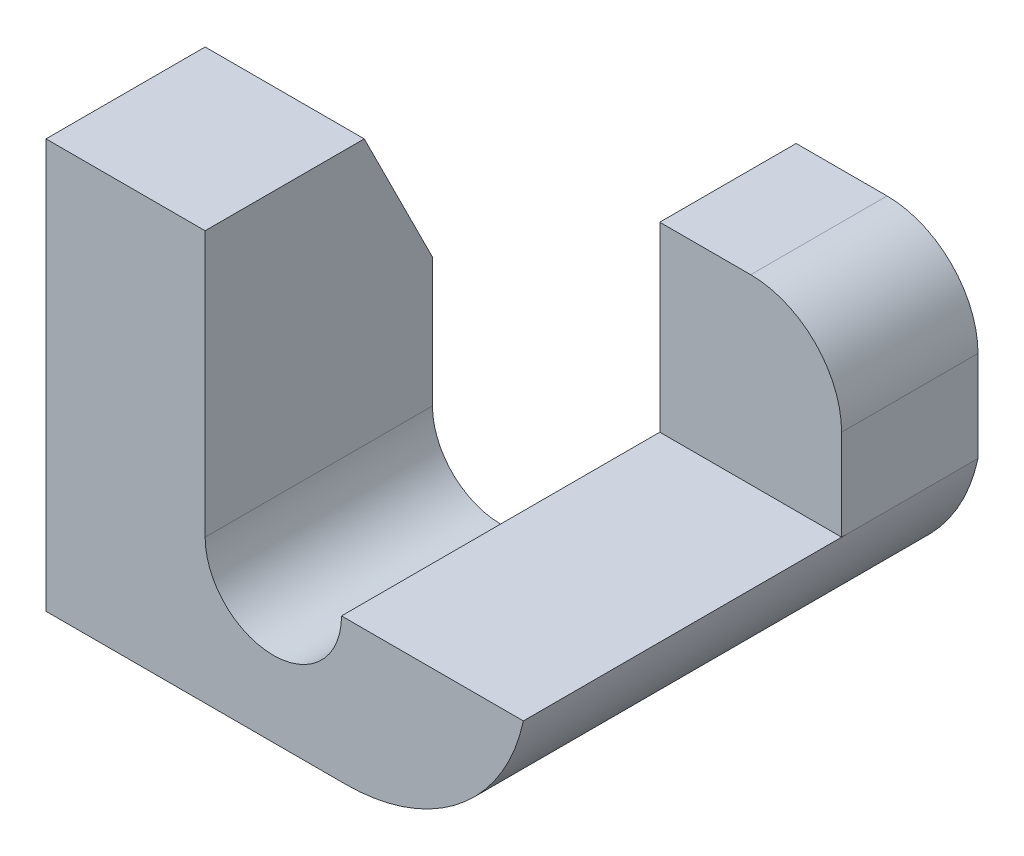
ISO-10303-21;
HEADER;
FILE_DESCRIPTION(('STEP AP214'),'2;1');
FILE_NAME('part.step','',(''),(''),'','','');
FILE_SCHEMA(('AUTOMOTIVE_DESIGN { 1 0 10303 214 1 1 1 1 }'));
ENDSEC;
DATA;
#1=APPLICATION_CONTEXT('core data for automotive mechanical design processes');
#2=APPLICATION_PROTOCOL_DEFINITION('international standard','automotive_design',2000,#1);
#3=PRODUCT_CONTEXT('',#1,'mechanical');
#4=PRODUCT('Part','Part','',(#3));
#5=PRODUCT_RELATED_PRODUCT_CATEGORY('part','',(#4));
#6=PRODUCT_DEFINITION_FORMATION('','',#4);
#7=PRODUCT_DEFINITION_CONTEXT('part definition',#1,'design');
#8=PRODUCT_DEFINITION('design','',#6,#7);
#9=PRODUCT_DEFINITION_SHAPE('','',#8);
#10=(LENGTH_UNIT() NAMED_UNIT(*) SI_UNIT(.MILLI.,.METRE.));
#11=(NAMED_UNIT(*) PLANE_ANGLE_UNIT() SI_UNIT($,.RADIAN.));
#12=(NAMED_UNIT(*) SI_UNIT($,.STERADIAN.) SOLID_ANGLE_UNIT());
#13=UNCERTAINTY_MEASURE_WITH_UNIT(LENGTH_MEASURE(1.E-05),#10,'distance_accuracy_value','');
#14=(GEOMETRIC_REPRESENTATION_CONTEXT(3) GLOBAL_UNCERTAINTY_ASSIGNED_CONTEXT((#13)) GLOBAL_UNIT_ASSIGNED_CONTEXT((#10,
#11,#12)) REPRESENTATION_CONTEXT('',''));
#15=CARTESIAN_POINT('',(0.,0.,0.));
#16=DIRECTION('',(0.,0.,1.));
#17=DIRECTION('',(1.,0.,0.));
#18=AXIS2_PLACEMENT_3D('',#15,#16,#17);
#19=CARTESIAN_POINT('',(52.,25.3004397130294,-40.));
#20=DIRECTION('',(0.,1.,0.));
#21=DIRECTION('',(0.,0.,1.));
#22=AXIS2_PLACEMENT_3D('',#19,#20,#21);
#23=PLANE('',#22);
#24=DIRECTION('',(0.,0.,1.));
#25=VECTOR('',#24,1.);
#26=CARTESIAN_POINT('',(84.,25.3004397130294,-40.));
#27=LINE('',#26,#25);
#28=CARTESIAN_POINT('',(84.,25.3004397130294,-56.));
#29=VERTEX_POINT('',#28);
#30=CARTESIAN_POINT('',(84.,25.3004397130294,0.));
#31=VERTEX_POINT('',#30);
#32=EDGE_CURVE('E221',#29,#31,#27,.T.);
#33=ORIENTED_EDGE('',*,*,#32,.F.);
#34=DIRECTION('',(1.,0.,0.));
#35=VECTOR('',#34,1.);
#36=CARTESIAN_POINT('',(52.,25.3004397130294,-56.));
#37=LINE('',#36,#35);
#38=CARTESIAN_POINT('',(52.,25.3004397130294,-56.));
#39=VERTEX_POINT('',#38);
#40=EDGE_CURVE('E302',#39,#29,#37,.T.);
#41=ORIENTED_EDGE('',*,*,#40,.F.);
#42=DIRECTION('',(0.,0.,1.));
#43=VECTOR('',#42,1.);
#44=CARTESIAN_POINT('',(52.,25.3004397130293,-80.));
#45=LINE('',#44,#43);
#46=CARTESIAN_POINT('',(52.,25.3004397130293,-40.));
#47=VERTEX_POINT('',#46);
#48=EDGE_CURVE('E274',#39,#47,#45,.T.);
#49=ORIENTED_EDGE('',*,*,#48,.T.);
#50=DIRECTION('',(0.,0.,1.));
#51=VECTOR('',#50,1.);
#52=CARTESIAN_POINT('',(52.,25.3004397130294,-40.));
#53=LINE('',#52,#51);
#54=CARTESIAN_POINT('',(52.,25.3004397130294,0.));
#55=VERTEX_POINT('',#54);
#56=EDGE_CURVE('E214',#47,#55,#53,.T.);
#57=ORIENTED_EDGE('',*,*,#56,.T.);
#58=DIRECTION('',(-1.,0.,0.));
#59=VECTOR('',#58,1.);
#60=CARTESIAN_POINT('',(52.,25.3004397130294,0.));
#61=LINE('',#60,#59);
#62=EDGE_CURVE('E182',#31,#55,#61,.T.);
#63=ORIENTED_EDGE('',*,*,#62,.F.);
#64=EDGE_LOOP('',(#33,#41,#49,#57,#63));
#65=FACE_BOUND('',#64,.T.);
#66=ADVANCED_FACE('F45',(#65),#23,.T.);
#67=CARTESIAN_POINT('',(40.,25.3004397130294,-40.));
#68=DIRECTION('',(0.,0.,1.));
#69=DIRECTION('',(1.,0.,0.));
#70=AXIS2_PLACEMENT_3D('',#67,#68,#69);
#71=PLANE('',#70);
#72=DIRECTION('',(0.,-1.,0.));
#73=VECTOR('',#72,1.);
#74=CARTESIAN_POINT('',(0.,0.,-40.));
#75=LINE('',#74,#73);
#76=CARTESIAN_POINT('',(0.,48.,-40.));
#77=VERTEX_POINT('',#76);
#78=CARTESIAN_POINT('',(0.,0.,-40.));
#79=VERTEX_POINT('',#78);
#80=EDGE_CURVE('E155',#77,#79,#75,.T.);
#81=ORIENTED_EDGE('',*,*,#80,.F.);
#82=DIRECTION('',(1.,0.,0.));
#83=VECTOR('',#82,1.);
#84=CARTESIAN_POINT('',(-4.,48.,-40.));
#85=LINE('',#84,#83);
#86=CARTESIAN_POINT('',(28.,48.,-40.));
#87=VERTEX_POINT('',#86);
#88=EDGE_CURVE('E140',#77,#87,#85,.T.);
#89=ORIENTED_EDGE('',*,*,#88,.T.);
#90=DIRECTION('',(0.,1.,0.));
#91=VECTOR('',#90,1.);
#92=CARTESIAN_POINT('',(28.,72.,-40.));
#93=LINE('',#92,#91);
#94=CARTESIAN_POINT('',(28.,25.3004397130294,-40.));
#95=VERTEX_POINT('',#94);
#96=EDGE_CURVE('E152',#95,#87,#93,.T.);
#97=ORIENTED_EDGE('',*,*,#96,.F.);
#98=CARTESIAN_POINT('',(40.,25.3004397130294,-40.));
#99=DIRECTION('',(0.,0.,-1.));
#100=DIRECTION('',(1.,0.,0.));
#101=AXIS2_PLACEMENT_3D('',#98,#99,#100);
#102=CIRCLE('',#101,12.);
#103=EDGE_CURVE('E163',#47,#95,#102,.T.);
#104=ORIENTED_EDGE('',*,*,#103,.F.);
#105=DIRECTION('',(0.,1.,0.));
#106=VECTOR('',#105,1.);
#107=CARTESIAN_POINT('',(52.,25.3004397130293,-40.));
#108=LINE('',#107,#106);
#109=CARTESIAN_POINT('',(52.,0.,-40.));
#110=VERTEX_POINT('',#109);
#111=EDGE_CURVE('E261',#110,#47,#108,.T.);
#112=ORIENTED_EDGE('',*,*,#111,.F.);
#113=DIRECTION('',(1.,0.,0.));
#114=VECTOR('',#113,1.);
#115=CARTESIAN_POINT('',(52.7091723989082,0.,-40.));
#116=LINE('',#115,#114);
#117=EDGE_CURVE('E169',#79,#110,#116,.T.);
#118=ORIENTED_EDGE('',*,*,#117,.F.);
#119=EDGE_LOOP('',(#81,#89,#97,#104,#112,#118));
#120=FACE_BOUND('',#119,.T.);
#121=ADVANCED_FACE('F150',(#120),#71,.F.);
#122=CARTESIAN_POINT('',(52.7091723989082,0.,-40.));
#123=DIRECTION('',(0.,-1.,0.));
#124=DIRECTION('',(0.,0.,-1.));
#125=AXIS2_PLACEMENT_3D('',#122,#123,#124);
#126=PLANE('',#125);
#127=DIRECTION('',(1.,0.,0.));
#128=VECTOR('',#127,1.);
#129=CARTESIAN_POINT('',(52.7091723989082,0.,0.));
#130=LINE('',#129,#128);
#131=CARTESIAN_POINT('',(0.,0.,0.));
#132=VERTEX_POINT('',#131);
#133=CARTESIAN_POINT('',(52.7091723989082,0.,0.));
#134=VERTEX_POINT('',#133);
#135=EDGE_CURVE('E173',#132,#134,#130,.T.);
#136=ORIENTED_EDGE('',*,*,#135,.F.);
#137=DIRECTION('',(0.,0.,1.));
#138=VECTOR('',#137,1.);
#139=CARTESIAN_POINT('',(0.,0.,-40.));
#140=LINE('',#139,#138);
#141=EDGE_CURVE('E202',#79,#132,#140,.T.);
#142=ORIENTED_EDGE('',*,*,#141,.F.);
#143=ORIENTED_EDGE('',*,*,#117,.T.);
#144=DIRECTION('',(0.,0.,1.));
#145=VECTOR('',#144,1.);
#146=CARTESIAN_POINT('',(52.,0.,-80.));
#147=LINE('',#146,#145);
#148=CARTESIAN_POINT('',(52.,0.,-80.));
#149=VERTEX_POINT('',#148);
#150=EDGE_CURVE('E178',#149,#110,#147,.T.);
#151=ORIENTED_EDGE('',*,*,#150,.F.);
#152=DIRECTION('',(-1.,0.,0.));
#153=VECTOR('',#152,1.);
#154=CARTESIAN_POINT('',(52.7091723989082,0.,-80.));
#155=LINE('',#154,#153);
#156=CARTESIAN_POINT('',(52.7091723989082,0.,-80.));
#157=VERTEX_POINT('',#156);
#158=EDGE_CURVE('E252',#157,#149,#155,.T.);
#159=ORIENTED_EDGE('',*,*,#158,.F.);
#160=DIRECTION('',(0.,0.,1.));
#161=VECTOR('',#160,1.);
#162=CARTESIAN_POINT('',(52.7091723989082,0.,-40.));
#163=LINE('',#162,#161);
#164=EDGE_CURVE('E167',#157,#134,#163,.T.);
#165=ORIENTED_EDGE('',*,*,#164,.T.);
#166=EDGE_LOOP('',(#136,#142,#143,#151,#159,#165));
#167=FACE_BOUND('',#166,.T.);
#168=ADVANCED_FACE('F248',(#167),#126,.T.);
#169=CARTESIAN_POINT('',(0.,0.,-40.));
#170=DIRECTION('',(-1.,0.,0.));
#171=DIRECTION('',(0.,0.,1.));
#172=AXIS2_PLACEMENT_3D('',#169,#170,#171);
#173=PLANE('',#172);
#174=DIRECTION('',(0.,0.894427190999916,0.447213595499958));
#175=VECTOR('',#174,1.);
#176=CARTESIAN_POINT('',(0.,9.6,-59.2));
#177=LINE('',#176,#175);
#178=CARTESIAN_POINT('',(0.,72.,-28.));
#179=VERTEX_POINT('',#178);
#180=EDGE_CURVE('E157',#77,#179,#177,.T.);
#181=ORIENTED_EDGE('',*,*,#180,.F.);
#182=ORIENTED_EDGE('',*,*,#80,.T.);
#183=ORIENTED_EDGE('',*,*,#141,.T.);
#184=DIRECTION('',(0.,-1.,0.));
#185=VECTOR('',#184,1.);
#186=CARTESIAN_POINT('',(0.,0.,0.));
#187=LINE('',#186,#185);
#188=CARTESIAN_POINT('',(0.,72.,0.));
#189=VERTEX_POINT('',#188);
#190=EDGE_CURVE('E198',#189,#132,#187,.T.);
#191=ORIENTED_EDGE('',*,*,#190,.F.);
#192=DIRECTION('',(0.,0.,1.));
#193=VECTOR('',#192,1.);
#194=CARTESIAN_POINT('',(0.,72.,-40.));
#195=LINE('',#194,#193);
#196=EDGE_CURVE('E206',#179,#189,#195,.T.);
#197=ORIENTED_EDGE('',*,*,#196,.F.);
#198=EDGE_LOOP('',(#181,#182,#183,#191,#197));
#199=FACE_BOUND('',#198,.T.);
#200=ADVANCED_FACE('F316',(#199),#173,.T.);
#201=CARTESIAN_POINT('',(0.,72.,-40.));
#202=DIRECTION('',(0.,1.,0.));
#203=DIRECTION('',(0.,0.,1.));
#204=AXIS2_PLACEMENT_3D('',#201,#202,#203);
#205=PLANE('',#204);
#206=DIRECTION('',(1.,0.,0.));
#207=VECTOR('',#206,1.);
#208=CARTESIAN_POINT('',(-4.,72.,-28.));
#209=LINE('',#208,#207);
#210=CARTESIAN_POINT('',(28.,72.,-28.));
#211=VERTEX_POINT('',#210);
#212=EDGE_CURVE('E61',#179,#211,#209,.T.);
#213=ORIENTED_EDGE('',*,*,#212,.F.);
#214=ORIENTED_EDGE('',*,*,#196,.T.);
#215=DIRECTION('',(-1.,0.,0.));
#216=VECTOR('',#215,1.);
#217=CARTESIAN_POINT('',(0.,72.,0.));
#218=LINE('',#217,#216);
#219=CARTESIAN_POINT('',(28.,72.,0.));
#220=VERTEX_POINT('',#219);
#221=EDGE_CURVE('E194',#220,#189,#218,.T.);
#222=ORIENTED_EDGE('',*,*,#221,.F.);
#223=DIRECTION('',(0.,0.,1.));
#224=VECTOR('',#223,1.);
#225=CARTESIAN_POINT('',(28.,72.,-40.));
#226=LINE('',#225,#224);
#227=EDGE_CURVE('E209',#211,#220,#226,.T.);
#228=ORIENTED_EDGE('',*,*,#227,.F.);
#229=EDGE_LOOP('',(#213,#214,#222,#228));
#230=FACE_BOUND('',#229,.T.);
#231=ADVANCED_FACE('F313',(#230),#205,.T.);
#232=CARTESIAN_POINT('',(28.,72.,-40.));
#233=DIRECTION('',(1.,0.,0.));
#234=DIRECTION('',(0.,1.,0.));
#235=AXIS2_PLACEMENT_3D('',#232,#233,#234);
#236=PLANE('',#235);
#237=DIRECTION('',(0.,-0.894427190999916,-0.447213595499958));
#238=VECTOR('',#237,1.);
#239=CARTESIAN_POINT('',(28.,72.,-28.));
#240=LINE('',#239,#238);
#241=EDGE_CURVE('E137',#211,#87,#240,.T.);
#242=ORIENTED_EDGE('',*,*,#241,.F.);
#243=ORIENTED_EDGE('',*,*,#227,.T.);
#244=DIRECTION('',(0.,1.,0.));
#245=VECTOR('',#244,1.);
#246=CARTESIAN_POINT('',(28.,72.,0.));
#247=LINE('',#246,#245);
#248=CARTESIAN_POINT('',(28.,25.3004397130294,0.));
#249=VERTEX_POINT('',#248);
#250=EDGE_CURVE('E190',#249,#220,#247,.T.);
#251=ORIENTED_EDGE('',*,*,#250,.F.);
#252=DIRECTION('',(0.,0.,1.));
#253=VECTOR('',#252,1.);
#254=CARTESIAN_POINT('',(28.,25.3004397130294,-40.));
#255=LINE('',#254,#253);
#256=EDGE_CURVE('E161',#95,#249,#255,.T.);
#257=ORIENTED_EDGE('',*,*,#256,.F.);
#258=ORIENTED_EDGE('',*,*,#96,.T.);
#259=EDGE_LOOP('',(#242,#243,#251,#257,#258));
#260=FACE_BOUND('',#259,.T.);
#261=ADVANCED_FACE('F159',(#260),#236,.T.);
#262=CARTESIAN_POINT('',(40.,25.3004397130294,-40.));
#263=DIRECTION('',(0.,0.,1.));
#264=DIRECTION('',(1.,0.,0.));
#265=AXIS2_PLACEMENT_3D('',#262,#263,#264);
#266=CYLINDRICAL_SURFACE('',#265,12.);
#267=CARTESIAN_POINT('',(40.,25.3004397130294,0.));
#268=DIRECTION('',(0.,0.,-1.));
#269=DIRECTION('',(1.,0.,0.));
#270=AXIS2_PLACEMENT_3D('',#267,#268,#269);
#271=CIRCLE('',#270,12.);
#272=EDGE_CURVE('E186',#55,#249,#271,.T.);
#273=ORIENTED_EDGE('',*,*,#272,.F.);
#274=ORIENTED_EDGE('',*,*,#56,.F.);
#275=ORIENTED_EDGE('',*,*,#103,.T.);
#276=ORIENTED_EDGE('',*,*,#256,.T.);
#277=EDGE_LOOP('',(#273,#274,#275,#276));
#278=FACE_BOUND('',#277,.T.);
#279=ADVANCED_FACE('F310',(#278),#266,.F.);
#280=CARTESIAN_POINT('',(52.7091723989082,32.,-40.));
#281=DIRECTION('',(0.,0.,1.));
#282=DIRECTION('',(1.,0.,0.));
#283=AXIS2_PLACEMENT_3D('',#280,#281,#282);
#284=CYLINDRICAL_SURFACE('',#283,32.);
#285=CARTESIAN_POINT('',(52.7091723989082,32.,0.));
#286=DIRECTION('',(0.,0.,1.));
#287=DIRECTION('',(1.,0.,0.));
#288=AXIS2_PLACEMENT_3D('',#285,#286,#287);
#289=CIRCLE('',#288,32.);
#290=EDGE_CURVE('E177',#134,#31,#289,.T.);
#291=ORIENTED_EDGE('',*,*,#290,.F.);
#292=ORIENTED_EDGE('',*,*,#164,.F.);
#293=CARTESIAN_POINT('',(52.7091723989082,32.,-80.));
#294=DIRECTION('',(0.,0.,-1.));
#295=DIRECTION('',(-1.,0.,0.));
#296=AXIS2_PLACEMENT_3D('',#293,#294,#295);
#297=CIRCLE('',#296,32.);
#298=CARTESIAN_POINT('',(84.,25.3004397130294,-80.));
#299=VERTEX_POINT('',#298);
#300=EDGE_CURVE('E254',#299,#157,#297,.T.);
#301=ORIENTED_EDGE('',*,*,#300,.F.);
#302=EDGE_CURVE('E217',#299,#29,#27,.T.);
#303=ORIENTED_EDGE('',*,*,#302,.T.);
#304=ORIENTED_EDGE('',*,*,#32,.T.);
#305=EDGE_LOOP('',(#291,#292,#301,#303,#304));
#306=FACE_BOUND('',#305,.T.);
#307=ADVANCED_FACE('F235',(#306),#284,.T.);
#308=CARTESIAN_POINT('',(40.,25.3004397130294,0.));
#309=DIRECTION('',(0.,0.,1.));
#310=DIRECTION('',(1.,0.,0.));
#311=AXIS2_PLACEMENT_3D('',#308,#309,#310);
#312=PLANE('',#311);
#313=ORIENTED_EDGE('',*,*,#135,.T.);
#314=ORIENTED_EDGE('',*,*,#290,.T.);
#315=ORIENTED_EDGE('',*,*,#62,.T.);
#316=ORIENTED_EDGE('',*,*,#272,.T.);
#317=ORIENTED_EDGE('',*,*,#250,.T.);
#318=ORIENTED_EDGE('',*,*,#221,.T.);
#319=ORIENTED_EDGE('',*,*,#190,.T.);
#320=EDGE_LOOP('',(#313,#314,#315,#316,#317,#318,#319));
#321=FACE_BOUND('',#320,.T.);
#322=ADVANCED_FACE('F243',(#321),#312,.T.);
#323=CARTESIAN_POINT('',(52.,25.3004397130293,-80.));
#324=DIRECTION('',(1.,0.,0.));
#325=DIRECTION('',(0.,0.,-1.));
#326=AXIS2_PLACEMENT_3D('',#323,#324,#325);
#327=PLANE('',#326);
#328=ORIENTED_EDGE('',*,*,#111,.T.);
#329=ORIENTED_EDGE('',*,*,#48,.F.);
#330=DIRECTION('',(0.,-1.,0.));
#331=VECTOR('',#330,1.);
#332=CARTESIAN_POINT('',(52.,57.3004397130294,-56.));
#333=LINE('',#332,#331);
#334=CARTESIAN_POINT('',(52.,57.3004397130294,-56.));
#335=VERTEX_POINT('',#334);
#336=EDGE_CURVE('E268',#335,#39,#333,.T.);
#337=ORIENTED_EDGE('',*,*,#336,.F.);
#338=DIRECTION('',(0.,0.,1.));
#339=VECTOR('',#338,1.);
#340=CARTESIAN_POINT('',(52.,57.3004397130294,-80.));
#341=LINE('',#340,#339);
#342=CARTESIAN_POINT('',(52.,57.3004397130294,-80.));
#343=VERTEX_POINT('',#342);
#344=EDGE_CURVE('E288',#343,#335,#341,.T.);
#345=ORIENTED_EDGE('',*,*,#344,.F.);
#346=DIRECTION('',(0.,1.,0.));
#347=VECTOR('',#346,1.);
#348=CARTESIAN_POINT('',(52.,25.3004397130293,-80.));
#349=LINE('',#348,#347);
#350=EDGE_CURVE('E265',#149,#343,#349,.T.);
#351=ORIENTED_EDGE('',*,*,#350,.F.);
#352=ORIENTED_EDGE('',*,*,#150,.T.);
#353=EDGE_LOOP('',(#328,#329,#337,#345,#351,#352));
#354=FACE_BOUND('',#353,.T.);
#355=ADVANCED_FACE('F283',(#354),#327,.F.);
#356=CARTESIAN_POINT('',(52.7091723989082,32.,-80.));
#357=DIRECTION('',(0.,0.,-1.));
#358=DIRECTION('',(-1.,0.,0.));
#359=AXIS2_PLACEMENT_3D('',#356,#357,#358);
#360=PLANE('',#359);
#361=DIRECTION('',(-1.,0.,0.));
#362=VECTOR('',#361,1.);
#363=CARTESIAN_POINT('',(52.,57.3004397130294,-80.));
#364=LINE('',#363,#362);
#365=CARTESIAN_POINT('',(68.,57.3004397130294,-80.));
#366=VERTEX_POINT('',#365);
#367=EDGE_CURVE('E289',#366,#343,#364,.T.);
#368=ORIENTED_EDGE('',*,*,#367,.F.);
#369=CARTESIAN_POINT('',(68.,41.3004397130294,-80.));
#370=DIRECTION('',(0.,0.,-1.));
#371=DIRECTION('',(-1.,0.,0.));
#372=AXIS2_PLACEMENT_3D('',#369,#370,#371);
#373=CIRCLE('',#372,16.);
#374=CARTESIAN_POINT('',(84.,41.3004397130294,-80.));
#375=VERTEX_POINT('',#374);
#376=EDGE_CURVE('E227',#366,#375,#373,.T.);
#377=ORIENTED_EDGE('',*,*,#376,.T.);
#378=DIRECTION('',(0.,-1.,0.));
#379=VECTOR('',#378,1.);
#380=CARTESIAN_POINT('',(84.,57.3004397130294,-80.));
#381=LINE('',#380,#379);
#382=EDGE_CURVE('E259',#375,#299,#381,.T.);
#383=ORIENTED_EDGE('',*,*,#382,.T.);
#384=ORIENTED_EDGE('',*,*,#300,.T.);
#385=ORIENTED_EDGE('',*,*,#158,.T.);
#386=ORIENTED_EDGE('',*,*,#350,.T.);
#387=EDGE_LOOP('',(#368,#377,#383,#384,#385,#386));
#388=FACE_BOUND('',#387,.T.);
#389=ADVANCED_FACE('F257',(#388),#360,.T.);
#390=CARTESIAN_POINT('',(52.,57.3004397130294,-56.));
#391=DIRECTION('',(0.,0.,-1.));
#392=DIRECTION('',(-1.,0.,0.));
#393=AXIS2_PLACEMENT_3D('',#390,#391,#392);
#394=PLANE('',#393);
#395=DIRECTION('',(0.,-1.,0.));
#396=VECTOR('',#395,1.);
#397=CARTESIAN_POINT('',(84.,57.3004397130294,-56.));
#398=LINE('',#397,#396);
#399=CARTESIAN_POINT('',(84.,41.3004397130294,-56.));
#400=VERTEX_POINT('',#399);
#401=EDGE_CURVE('E296',#400,#29,#398,.T.);
#402=ORIENTED_EDGE('',*,*,#401,.F.);
#403=CARTESIAN_POINT('',(68.,41.3004397130294,-56.));
#404=DIRECTION('',(0.,0.,-1.));
#405=DIRECTION('',(-1.,0.,0.));
#406=AXIS2_PLACEMENT_3D('',#403,#404,#405);
#407=CIRCLE('',#406,16.);
#408=CARTESIAN_POINT('',(68.,57.3004397130294,-56.));
#409=VERTEX_POINT('',#408);
#410=EDGE_CURVE('E11',#400,#409,#407,.F.);
#411=ORIENTED_EDGE('',*,*,#410,.T.);
#412=DIRECTION('',(1.,0.,0.));
#413=VECTOR('',#412,1.);
#414=CARTESIAN_POINT('',(52.,57.3004397130294,-56.));
#415=LINE('',#414,#413);
#416=EDGE_CURVE('E292',#335,#409,#415,.T.);
#417=ORIENTED_EDGE('',*,*,#416,.F.);
#418=ORIENTED_EDGE('',*,*,#336,.T.);
#419=ORIENTED_EDGE('',*,*,#40,.T.);
#420=EDGE_LOOP('',(#402,#411,#417,#418,#419));
#421=FACE_BOUND('',#420,.T.);
#422=ADVANCED_FACE('F308',(#421),#394,.F.);
#423=CARTESIAN_POINT('',(84.,57.3004397130294,-80.));
#424=DIRECTION('',(-1.,0.,0.));
#425=DIRECTION('',(0.,0.,1.));
#426=AXIS2_PLACEMENT_3D('',#423,#424,#425);
#427=PLANE('',#426);
#428=ORIENTED_EDGE('',*,*,#382,.F.);
#429=DIRECTION('',(0.,0.,-1.));
#430=VECTOR('',#429,1.);
#431=CARTESIAN_POINT('',(84.,41.3004397130294,-56.));
#432=LINE('',#431,#430);
#433=EDGE_CURVE('E54',#375,#400,#432,.F.);
#434=ORIENTED_EDGE('',*,*,#433,.T.);
#435=ORIENTED_EDGE('',*,*,#401,.T.);
#436=ORIENTED_EDGE('',*,*,#302,.F.);
#437=EDGE_LOOP('',(#428,#434,#435,#436));
#438=FACE_BOUND('',#437,.T.);
#439=ADVANCED_FACE('F332',(#438),#427,.F.);
#440=CARTESIAN_POINT('',(0.,57.3004397130294,0.));
#441=DIRECTION('',(0.,1.,0.));
#442=DIRECTION('',(0.,0.,1.));
#443=AXIS2_PLACEMENT_3D('',#440,#441,#442);
#444=PLANE('',#443);
#445=ORIENTED_EDGE('',*,*,#416,.T.);
#446=DIRECTION('',(0.,0.,-1.));
#447=VECTOR('',#446,1.);
#448=CARTESIAN_POINT('',(68.,57.3004397130294,-80.));
#449=LINE('',#448,#447);
#450=EDGE_CURVE('E205',#409,#366,#449,.T.);
#451=ORIENTED_EDGE('',*,*,#450,.T.);
#452=ORIENTED_EDGE('',*,*,#367,.T.);
#453=ORIENTED_EDGE('',*,*,#344,.T.);
#454=EDGE_LOOP('',(#445,#451,#452,#453));
#455=FACE_BOUND('',#454,.T.);
#456=ADVANCED_FACE('F321',(#455),#444,.T.);
#457=CARTESIAN_POINT('',(68.,41.3004397130294,0.));
#458=DIRECTION('',(0.,0.,1.));
#459=DIRECTION('',(1.,0.,0.));
#460=AXIS2_PLACEMENT_3D('',#457,#458,#459);
#461=CYLINDRICAL_SURFACE('',#460,16.);
#462=ORIENTED_EDGE('',*,*,#410,.F.);
#463=ORIENTED_EDGE('',*,*,#433,.F.);
#464=ORIENTED_EDGE('',*,*,#376,.F.);
#465=ORIENTED_EDGE('',*,*,#450,.F.);
#466=EDGE_LOOP('',(#462,#463,#464,#465));
#467=FACE_BOUND('',#466,.T.);
#468=ADVANCED_FACE('F47',(#467),#461,.T.);
#469=CARTESIAN_POINT('',(-4.,72.,-28.));
#470=DIRECTION('',(0.,-0.447213595499958,0.894427190999916));
#471=DIRECTION('',(0.,-0.894427190999916,-0.447213595499958));
#472=AXIS2_PLACEMENT_3D('',#469,#470,#471);
#473=PLANE('',#472);
#474=ORIENTED_EDGE('',*,*,#180,.T.);
#475=ORIENTED_EDGE('',*,*,#212,.T.);
#476=ORIENTED_EDGE('',*,*,#241,.T.);
#477=ORIENTED_EDGE('',*,*,#88,.F.);
#478=EDGE_LOOP('',(#474,#475,#476,#477));
#479=FACE_BOUND('',#478,.T.);
#480=ADVANCED_FACE('F139',(#479),#473,.F.);
#481=CLOSED_SHELL('',(#66,#121,#168,#200,#231,#261,#279,#307,#322,#355,#389,#422,#439,#456,#468,#480));
#482=MANIFOLD_SOLID_BREP('B2',#481);
#483=ADVANCED_BREP_SHAPE_REPRESENTATION('',(#18,#482),#14);
#484=SHAPE_DEFINITION_REPRESENTATION(#9,#483);
ENDSEC;
END-ISO-10303-21;
